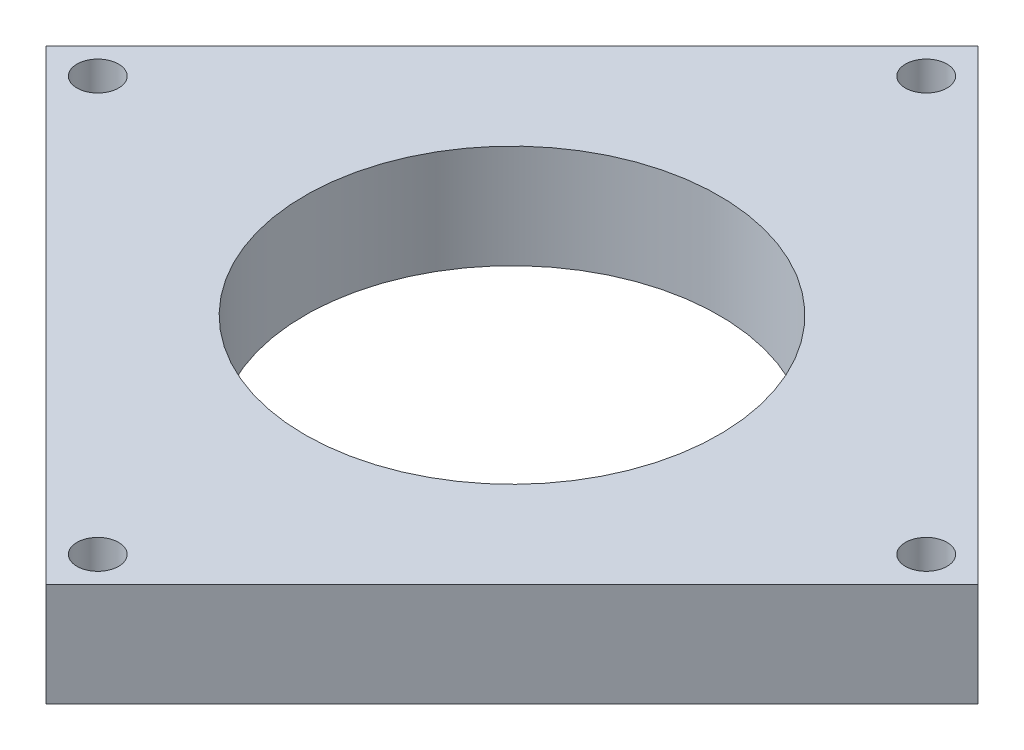
ISO-10303-21;
HEADER;
FILE_DESCRIPTION(('STEP AP214'),'2;1');
FILE_NAME('part.step','',(''),(''),'','','');
FILE_SCHEMA(('AUTOMOTIVE_DESIGN { 1 0 10303 214 1 1 1 1 }'));
ENDSEC;
DATA;
#1=APPLICATION_CONTEXT('core data for automotive mechanical design processes');
#2=APPLICATION_PROTOCOL_DEFINITION('international standard','automotive_design',2000,#1);
#3=PRODUCT_CONTEXT('',#1,'mechanical');
#4=PRODUCT('Part','Part','',(#3));
#5=PRODUCT_RELATED_PRODUCT_CATEGORY('part','',(#4));
#6=PRODUCT_DEFINITION_FORMATION('','',#4);
#7=PRODUCT_DEFINITION_CONTEXT('part definition',#1,'design');
#8=PRODUCT_DEFINITION('design','',#6,#7);
#9=PRODUCT_DEFINITION_SHAPE('','',#8);
#10=(LENGTH_UNIT() NAMED_UNIT(*) SI_UNIT(.MILLI.,.METRE.));
#11=(NAMED_UNIT(*) PLANE_ANGLE_UNIT() SI_UNIT($,.RADIAN.));
#12=(NAMED_UNIT(*) SI_UNIT($,.STERADIAN.) SOLID_ANGLE_UNIT());
#13=UNCERTAINTY_MEASURE_WITH_UNIT(LENGTH_MEASURE(1.E-05),#10,'distance_accuracy_value','');
#14=(GEOMETRIC_REPRESENTATION_CONTEXT(3) GLOBAL_UNCERTAINTY_ASSIGNED_CONTEXT((#13)) GLOBAL_UNIT_ASSIGNED_CONTEXT((#10,
#11,#12)) REPRESENTATION_CONTEXT('',''));
#15=CARTESIAN_POINT('',(0.,0.,0.));
#16=DIRECTION('',(0.,0.,1.));
#17=DIRECTION('',(1.,0.,0.));
#18=AXIS2_PLACEMENT_3D('',#15,#16,#17);
#19=CARTESIAN_POINT('',(-57.15,12.7,0.));
#20=DIRECTION('',(0.,-1.,0.));
#21=DIRECTION('',(0.,0.,-1.));
#22=AXIS2_PLACEMENT_3D('',#19,#20,#21);
#23=PLANE('',#22);
#24=DIRECTION('',(0.707106781186548,0.,0.707106781186547));
#25=VECTOR('',#24,1.);
#26=CARTESIAN_POINT('',(0.,12.7,57.15));
#27=LINE('',#26,#25);
#28=CARTESIAN_POINT('',(-57.15,12.7,0.));
#29=VERTEX_POINT('',#28);
#30=CARTESIAN_POINT('',(0.,12.7,57.15));
#31=VERTEX_POINT('',#30);
#32=EDGE_CURVE('E83',#29,#31,#27,.T.);
#33=ORIENTED_EDGE('',*,*,#32,.T.);
#34=DIRECTION('',(0.707106781186547,0.,-0.707106781186547));
#35=VECTOR('',#34,1.);
#36=CARTESIAN_POINT('',(0.,12.7,57.15));
#37=LINE('',#36,#35);
#38=CARTESIAN_POINT('',(57.15,12.7,0.));
#39=VERTEX_POINT('',#38);
#40=EDGE_CURVE('E78',#31,#39,#37,.T.);
#41=ORIENTED_EDGE('',*,*,#40,.T.);
#42=DIRECTION('',(-0.707106781186547,0.,-0.707106781186548));
#43=VECTOR('',#42,1.);
#44=CARTESIAN_POINT('',(57.15,12.7,0.));
#45=LINE('',#44,#43);
#46=CARTESIAN_POINT('',(0.,12.7,-57.15));
#47=VERTEX_POINT('',#46);
#48=EDGE_CURVE('E81',#39,#47,#45,.T.);
#49=ORIENTED_EDGE('',*,*,#48,.T.);
#50=DIRECTION('',(-0.707106781186547,0.,0.707106781186548));
#51=VECTOR('',#50,1.);
#52=CARTESIAN_POINT('',(-57.15,12.7,0.));
#53=LINE('',#52,#51);
#54=EDGE_CURVE('E48',#47,#29,#53,.T.);
#55=ORIENTED_EDGE('',*,*,#54,.T.);
#56=EDGE_LOOP('',(#33,#41,#49,#55));
#57=FACE_BOUND('',#56,.T.);
#58=CARTESIAN_POINT('',(0.,12.7,0.));
#59=DIRECTION('',(0.,1.,0.));
#60=DIRECTION('',(0.,0.,1.));
#61=AXIS2_PLACEMENT_3D('',#58,#59,#60);
#62=CIRCLE('',#61,25.4);
#63=CARTESIAN_POINT('',(0.,12.7,25.4));
#64=VERTEX_POINT('',#63);
#65=EDGE_CURVE('E109',#64,#64,#62,.T.);
#66=ORIENTED_EDGE('',*,*,#65,.F.);
#67=EDGE_LOOP('',(#66));
#68=FACE_BOUND('',#67,.T.);
#69=CARTESIAN_POINT('',(0.,12.7,-50.8));
#70=DIRECTION('',(0.,1.,0.));
#71=DIRECTION('',(0.,0.,1.));
#72=AXIS2_PLACEMENT_3D('',#69,#70,#71);
#73=CIRCLE('',#72,2.55269999999999);
#74=CARTESIAN_POINT('',(0.,12.7,-48.2473));
#75=VERTEX_POINT('',#74);
#76=EDGE_CURVE('E117',#75,#75,#73,.T.);
#77=ORIENTED_EDGE('',*,*,#76,.F.);
#78=EDGE_LOOP('',(#77));
#79=FACE_BOUND('',#78,.T.);
#80=CARTESIAN_POINT('',(50.8,12.7,1.77367354744357E-13));
#81=DIRECTION('',(0.,1.,0.));
#82=DIRECTION('',(0.,0.,1.));
#83=AXIS2_PLACEMENT_3D('',#80,#81,#82);
#84=CIRCLE('',#83,2.55269999999999);
#85=CARTESIAN_POINT('',(50.8,12.7,2.55270000000017));
#86=VERTEX_POINT('',#85);
#87=EDGE_CURVE('E123',#86,#86,#84,.T.);
#88=ORIENTED_EDGE('',*,*,#87,.F.);
#89=EDGE_LOOP('',(#88));
#90=FACE_BOUND('',#89,.T.);
#91=CARTESIAN_POINT('',(0.,12.7,50.8));
#92=DIRECTION('',(0.,1.,0.));
#93=DIRECTION('',(0.,0.,1.));
#94=AXIS2_PLACEMENT_3D('',#91,#92,#93);
#95=CIRCLE('',#94,2.55269999999999);
#96=CARTESIAN_POINT('',(0.,12.7,53.3527));
#97=VERTEX_POINT('',#96);
#98=EDGE_CURVE('E129',#97,#97,#95,.T.);
#99=ORIENTED_EDGE('',*,*,#98,.F.);
#100=EDGE_LOOP('',(#99));
#101=FACE_BOUND('',#100,.T.);
#102=CARTESIAN_POINT('',(-50.8,12.7,-5.3210206423307E-13));
#103=DIRECTION('',(0.,1.,0.));
#104=DIRECTION('',(0.,0.,1.));
#105=AXIS2_PLACEMENT_3D('',#102,#103,#104);
#106=CIRCLE('',#105,2.55269999999999);
#107=CARTESIAN_POINT('',(-50.8,12.7,2.55269999999946));
#108=VERTEX_POINT('',#107);
#109=EDGE_CURVE('E135',#108,#108,#106,.T.);
#110=ORIENTED_EDGE('',*,*,#109,.F.);
#111=EDGE_LOOP('',(#110));
#112=FACE_BOUND('',#111,.T.);
#113=ADVANCED_FACE('F31',(#57,#68,#79,#90,#101,#112),#23,.F.);
#114=CARTESIAN_POINT('',(0.,12.7,57.15));
#115=DIRECTION('',(0.707106781186547,0.,-0.707106781186548));
#116=DIRECTION('',(-0.707106781186548,0.,-0.707106781186547));
#117=AXIS2_PLACEMENT_3D('',#114,#115,#116);
#118=PLANE('',#117);
#119=DIRECTION('',(0.707106781186548,0.,0.707106781186547));
#120=VECTOR('',#119,1.);
#121=CARTESIAN_POINT('',(0.,0.,57.15));
#122=LINE('',#121,#120);
#123=CARTESIAN_POINT('',(-57.15,0.,0.));
#124=VERTEX_POINT('',#123);
#125=CARTESIAN_POINT('',(0.,0.,57.15));
#126=VERTEX_POINT('',#125);
#127=EDGE_CURVE('E95',#124,#126,#122,.T.);
#128=ORIENTED_EDGE('',*,*,#127,.T.);
#129=DIRECTION('',(0.,-1.,0.));
#130=VECTOR('',#129,1.);
#131=CARTESIAN_POINT('',(0.,12.7,57.15));
#132=LINE('',#131,#130);
#133=EDGE_CURVE('E11',#31,#126,#132,.T.);
#134=ORIENTED_EDGE('',*,*,#133,.F.);
#135=ORIENTED_EDGE('',*,*,#32,.F.);
#136=DIRECTION('',(0.,-1.,0.));
#137=VECTOR('',#136,1.);
#138=CARTESIAN_POINT('',(-57.15,12.7,0.));
#139=LINE('',#138,#137);
#140=EDGE_CURVE('E91',#29,#124,#139,.T.);
#141=ORIENTED_EDGE('',*,*,#140,.T.);
#142=EDGE_LOOP('',(#128,#134,#135,#141));
#143=FACE_BOUND('',#142,.T.);
#144=ADVANCED_FACE('F33',(#143),#118,.F.);
#145=CARTESIAN_POINT('',(0.,12.7,57.15));
#146=DIRECTION('',(-0.707106781186548,0.,-0.707106781186548));
#147=DIRECTION('',(-0.707106781186548,0.,0.707106781186548));
#148=AXIS2_PLACEMENT_3D('',#145,#146,#147);
#149=PLANE('',#148);
#150=DIRECTION('',(0.707106781186547,0.,-0.707106781186547));
#151=VECTOR('',#150,1.);
#152=CARTESIAN_POINT('',(0.,0.,57.15));
#153=LINE('',#152,#151);
#154=CARTESIAN_POINT('',(57.15,0.,0.));
#155=VERTEX_POINT('',#154);
#156=EDGE_CURVE('E87',#126,#155,#153,.T.);
#157=ORIENTED_EDGE('',*,*,#156,.T.);
#158=DIRECTION('',(0.,-1.,0.));
#159=VECTOR('',#158,1.);
#160=CARTESIAN_POINT('',(57.15,12.7,0.));
#161=LINE('',#160,#159);
#162=EDGE_CURVE('E40',#39,#155,#161,.T.);
#163=ORIENTED_EDGE('',*,*,#162,.F.);
#164=ORIENTED_EDGE('',*,*,#40,.F.);
#165=ORIENTED_EDGE('',*,*,#133,.T.);
#166=EDGE_LOOP('',(#157,#163,#164,#165));
#167=FACE_BOUND('',#166,.T.);
#168=ADVANCED_FACE('F86',(#167),#149,.F.);
#169=CARTESIAN_POINT('',(57.15,12.7,0.));
#170=DIRECTION('',(-0.707106781186548,0.,0.707106781186547));
#171=DIRECTION('',(0.707106781186547,0.,0.707106781186548));
#172=AXIS2_PLACEMENT_3D('',#169,#170,#171);
#173=PLANE('',#172);
#174=DIRECTION('',(-0.707106781186547,0.,-0.707106781186548));
#175=VECTOR('',#174,1.);
#176=CARTESIAN_POINT('',(57.15,0.,0.));
#177=LINE('',#176,#175);
#178=CARTESIAN_POINT('',(0.,0.,-57.15));
#179=VERTEX_POINT('',#178);
#180=EDGE_CURVE('E65',#155,#179,#177,.T.);
#181=ORIENTED_EDGE('',*,*,#180,.T.);
#182=DIRECTION('',(0.,-1.,0.));
#183=VECTOR('',#182,1.);
#184=CARTESIAN_POINT('',(0.,12.7,-57.15));
#185=LINE('',#184,#183);
#186=EDGE_CURVE('E88',#47,#179,#185,.T.);
#187=ORIENTED_EDGE('',*,*,#186,.F.);
#188=ORIENTED_EDGE('',*,*,#48,.F.);
#189=ORIENTED_EDGE('',*,*,#162,.T.);
#190=EDGE_LOOP('',(#181,#187,#188,#189));
#191=FACE_BOUND('',#190,.T.);
#192=ADVANCED_FACE('F89',(#191),#173,.F.);
#193=CARTESIAN_POINT('',(-57.15,12.7,0.));
#194=DIRECTION('',(0.707106781186548,0.,0.707106781186547));
#195=DIRECTION('',(0.707106781186547,0.,-0.707106781186548));
#196=AXIS2_PLACEMENT_3D('',#193,#194,#195);
#197=PLANE('',#196);
#198=DIRECTION('',(-0.707106781186547,0.,0.707106781186548));
#199=VECTOR('',#198,1.);
#200=CARTESIAN_POINT('',(-57.15,0.,0.));
#201=LINE('',#200,#199);
#202=EDGE_CURVE('E71',#179,#124,#201,.T.);
#203=ORIENTED_EDGE('',*,*,#202,.T.);
#204=ORIENTED_EDGE('',*,*,#140,.F.);
#205=ORIENTED_EDGE('',*,*,#54,.F.);
#206=ORIENTED_EDGE('',*,*,#186,.T.);
#207=EDGE_LOOP('',(#203,#204,#205,#206));
#208=FACE_BOUND('',#207,.T.);
#209=ADVANCED_FACE('F103',(#208),#197,.F.);
#210=CARTESIAN_POINT('',(-57.15,0.,0.));
#211=DIRECTION('',(0.,-1.,0.));
#212=DIRECTION('',(0.,0.,-1.));
#213=AXIS2_PLACEMENT_3D('',#210,#211,#212);
#214=PLANE('',#213);
#215=CARTESIAN_POINT('',(-50.8,0.,-5.3210206423307E-13));
#216=DIRECTION('',(0.,1.,0.));
#217=DIRECTION('',(0.,0.,1.));
#218=AXIS2_PLACEMENT_3D('',#215,#216,#217);
#219=CIRCLE('',#218,2.5527);
#220=CARTESIAN_POINT('',(-50.8,0.,2.55269999999947));
#221=VERTEX_POINT('',#220);
#222=EDGE_CURVE('E132',#221,#221,#219,.T.);
#223=ORIENTED_EDGE('',*,*,#222,.T.);
#224=EDGE_LOOP('',(#223));
#225=FACE_BOUND('',#224,.T.);
#226=CARTESIAN_POINT('',(0.,0.,50.8));
#227=DIRECTION('',(0.,1.,0.));
#228=DIRECTION('',(0.,0.,1.));
#229=AXIS2_PLACEMENT_3D('',#226,#227,#228);
#230=CIRCLE('',#229,2.5527);
#231=CARTESIAN_POINT('',(0.,0.,53.3527));
#232=VERTEX_POINT('',#231);
#233=EDGE_CURVE('E126',#232,#232,#230,.T.);
#234=ORIENTED_EDGE('',*,*,#233,.T.);
#235=EDGE_LOOP('',(#234));
#236=FACE_BOUND('',#235,.T.);
#237=CARTESIAN_POINT('',(50.8,0.,1.77367354744357E-13));
#238=DIRECTION('',(0.,1.,0.));
#239=DIRECTION('',(0.,0.,1.));
#240=AXIS2_PLACEMENT_3D('',#237,#238,#239);
#241=CIRCLE('',#240,2.5527);
#242=CARTESIAN_POINT('',(50.8,0.,2.55270000000018));
#243=VERTEX_POINT('',#242);
#244=EDGE_CURVE('E120',#243,#243,#241,.T.);
#245=ORIENTED_EDGE('',*,*,#244,.T.);
#246=EDGE_LOOP('',(#245));
#247=FACE_BOUND('',#246,.T.);
#248=CARTESIAN_POINT('',(0.,0.,-50.8));
#249=DIRECTION('',(0.,1.,0.));
#250=DIRECTION('',(0.,0.,1.));
#251=AXIS2_PLACEMENT_3D('',#248,#249,#250);
#252=CIRCLE('',#251,2.5527);
#253=CARTESIAN_POINT('',(0.,0.,-48.2473));
#254=VERTEX_POINT('',#253);
#255=EDGE_CURVE('E112',#254,#254,#252,.T.);
#256=ORIENTED_EDGE('',*,*,#255,.T.);
#257=EDGE_LOOP('',(#256));
#258=FACE_BOUND('',#257,.T.);
#259=CARTESIAN_POINT('',(0.,0.,0.));
#260=DIRECTION('',(0.,1.,0.));
#261=DIRECTION('',(0.,0.,1.));
#262=AXIS2_PLACEMENT_3D('',#259,#260,#261);
#263=CIRCLE('',#262,25.4);
#264=CARTESIAN_POINT('',(0.,0.,25.4));
#265=VERTEX_POINT('',#264);
#266=EDGE_CURVE('E98',#265,#265,#263,.T.);
#267=ORIENTED_EDGE('',*,*,#266,.T.);
#268=EDGE_LOOP('',(#267));
#269=FACE_BOUND('',#268,.T.);
#270=ORIENTED_EDGE('',*,*,#127,.F.);
#271=ORIENTED_EDGE('',*,*,#202,.F.);
#272=ORIENTED_EDGE('',*,*,#180,.F.);
#273=ORIENTED_EDGE('',*,*,#156,.F.);
#274=EDGE_LOOP('',(#270,#271,#272,#273));
#275=FACE_BOUND('',#274,.T.);
#276=ADVANCED_FACE('F106',(#225,#236,#247,#258,#269,#275),#214,.T.);
#277=CARTESIAN_POINT('',(0.,0.,0.));
#278=DIRECTION('',(0.,1.,0.));
#279=DIRECTION('',(0.,0.,1.));
#280=AXIS2_PLACEMENT_3D('',#277,#278,#279);
#281=CYLINDRICAL_SURFACE('',#280,25.4);
#282=ORIENTED_EDGE('',*,*,#266,.F.);
#283=EDGE_LOOP('',(#282));
#284=FACE_BOUND('',#283,.T.);
#285=ORIENTED_EDGE('',*,*,#65,.T.);
#286=EDGE_LOOP('',(#285));
#287=FACE_BOUND('',#286,.T.);
#288=ADVANCED_FACE('F148',(#284,#287),#281,.F.);
#289=CARTESIAN_POINT('',(0.,12.7,-50.8));
#290=DIRECTION('',(0.,1.,0.));
#291=DIRECTION('',(0.,0.,1.));
#292=AXIS2_PLACEMENT_3D('',#289,#290,#291);
#293=CYLINDRICAL_SURFACE('',#292,2.55269999999999);
#294=ORIENTED_EDGE('',*,*,#255,.F.);
#295=EDGE_LOOP('',(#294));
#296=FACE_BOUND('',#295,.T.);
#297=ORIENTED_EDGE('',*,*,#76,.T.);
#298=EDGE_LOOP('',(#297));
#299=FACE_BOUND('',#298,.T.);
#300=ADVANCED_FACE('F180',(#296,#299),#293,.F.);
#301=CARTESIAN_POINT('',(50.8,12.7,1.77367354744357E-13));
#302=DIRECTION('',(0.,1.,0.));
#303=DIRECTION('',(0.,0.,1.));
#304=AXIS2_PLACEMENT_3D('',#301,#302,#303);
#305=CYLINDRICAL_SURFACE('',#304,2.55269999999999);
#306=ORIENTED_EDGE('',*,*,#244,.F.);
#307=EDGE_LOOP('',(#306));
#308=FACE_BOUND('',#307,.T.);
#309=ORIENTED_EDGE('',*,*,#87,.T.);
#310=EDGE_LOOP('',(#309));
#311=FACE_BOUND('',#310,.T.);
#312=ADVANCED_FACE('F187',(#308,#311),#305,.F.);
#313=CARTESIAN_POINT('',(0.,12.7,50.8));
#314=DIRECTION('',(0.,1.,0.));
#315=DIRECTION('',(0.,0.,1.));
#316=AXIS2_PLACEMENT_3D('',#313,#314,#315);
#317=CYLINDRICAL_SURFACE('',#316,2.55269999999999);
#318=ORIENTED_EDGE('',*,*,#233,.F.);
#319=EDGE_LOOP('',(#318));
#320=FACE_BOUND('',#319,.T.);
#321=ORIENTED_EDGE('',*,*,#98,.T.);
#322=EDGE_LOOP('',(#321));
#323=FACE_BOUND('',#322,.T.);
#324=ADVANCED_FACE('F193',(#320,#323),#317,.F.);
#325=CARTESIAN_POINT('',(-50.8,12.7,-5.3210206423307E-13));
#326=DIRECTION('',(0.,1.,0.));
#327=DIRECTION('',(0.,0.,1.));
#328=AXIS2_PLACEMENT_3D('',#325,#326,#327);
#329=CYLINDRICAL_SURFACE('',#328,2.55269999999999);
#330=ORIENTED_EDGE('',*,*,#222,.F.);
#331=EDGE_LOOP('',(#330));
#332=FACE_BOUND('',#331,.T.);
#333=ORIENTED_EDGE('',*,*,#109,.T.);
#334=EDGE_LOOP('',(#333));
#335=FACE_BOUND('',#334,.T.);
#336=ADVANCED_FACE('F139',(#332,#335),#329,.F.);
#337=CLOSED_SHELL('',(#113,#144,#168,#192,#209,#276,#288,#300,#312,#324,#336));
#338=MANIFOLD_SOLID_BREP('B2',#337);
#339=ADVANCED_BREP_SHAPE_REPRESENTATION('',(#18,#338),#14);
#340=SHAPE_DEFINITION_REPRESENTATION(#9,#339);
ENDSEC;
END-ISO-10303-21;
